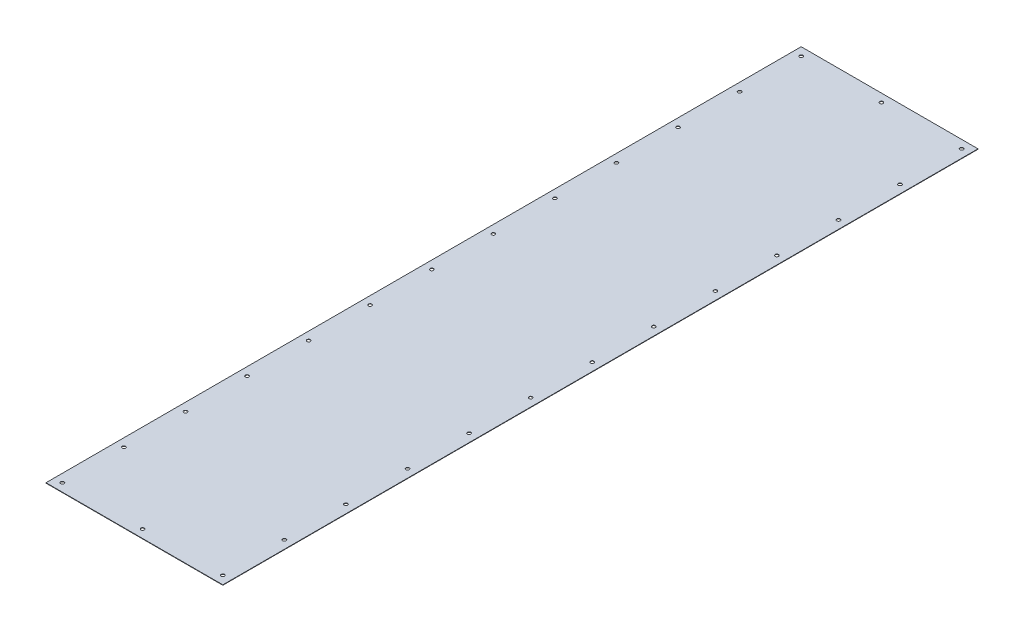
ISO-10303-21;
HEADER;
FILE_DESCRIPTION(('STEP AP214'),'2;1');
FILE_NAME('part.step','',(''),(''),'','','');
FILE_SCHEMA(('AUTOMOTIVE_DESIGN { 1 0 10303 214 1 1 1 1 }'));
ENDSEC;
DATA;
#1=APPLICATION_CONTEXT('core data for automotive mechanical design processes');
#2=APPLICATION_PROTOCOL_DEFINITION('international standard','automotive_design',2000,#1);
#3=PRODUCT_CONTEXT('',#1,'mechanical');
#4=PRODUCT('Part','Part','',(#3));
#5=PRODUCT_RELATED_PRODUCT_CATEGORY('part','',(#4));
#6=PRODUCT_DEFINITION_FORMATION('','',#4);
#7=PRODUCT_DEFINITION_CONTEXT('part definition',#1,'design');
#8=PRODUCT_DEFINITION('design','',#6,#7);
#9=PRODUCT_DEFINITION_SHAPE('','',#8);
#10=(LENGTH_UNIT() NAMED_UNIT(*) SI_UNIT(.MILLI.,.METRE.));
#11=(NAMED_UNIT(*) PLANE_ANGLE_UNIT() SI_UNIT($,.RADIAN.));
#12=(NAMED_UNIT(*) SI_UNIT($,.STERADIAN.) SOLID_ANGLE_UNIT());
#13=UNCERTAINTY_MEASURE_WITH_UNIT(LENGTH_MEASURE(1.E-05),#10,'distance_accuracy_value','');
#14=(GEOMETRIC_REPRESENTATION_CONTEXT(3) GLOBAL_UNCERTAINTY_ASSIGNED_CONTEXT((#13)) GLOBAL_UNIT_ASSIGNED_CONTEXT((#10,
#11,#12)) REPRESENTATION_CONTEXT('',''));
#15=CARTESIAN_POINT('',(0.,0.,0.));
#16=DIRECTION('',(0.,0.,1.));
#17=DIRECTION('',(1.,0.,0.));
#18=AXIS2_PLACEMENT_3D('',#15,#16,#17);
#19=CARTESIAN_POINT('',(0.,1.,0.));
#20=DIRECTION('',(0.,1.,0.));
#21=DIRECTION('',(0.,0.,1.));
#22=AXIS2_PLACEMENT_3D('',#19,#20,#21);
#23=PLANE('',#22);
#24=CARTESIAN_POINT('',(195.425000000019,1.,900.));
#25=DIRECTION('',(0.,1.,0.));
#26=DIRECTION('',(0.,0.,1.));
#27=AXIS2_PLACEMENT_3D('',#24,#25,#26);
#28=CIRCLE('',#27,4.1);
#29=CARTESIAN_POINT('',(195.425000000019,1.,904.1));
#30=VERTEX_POINT('',#29);
#31=EDGE_CURVE('E265',#30,#30,#28,.T.);
#32=ORIENTED_EDGE('',*,*,#31,.F.);
#33=EDGE_LOOP('',(#32));
#34=FACE_BOUND('',#33,.T.);
#35=CARTESIAN_POINT('',(195.425000000017,1.,750.));
#36=DIRECTION('',(0.,1.,0.));
#37=DIRECTION('',(0.,0.,1.));
#38=AXIS2_PLACEMENT_3D('',#35,#36,#37);
#39=CIRCLE('',#38,4.1);
#40=CARTESIAN_POINT('',(195.425000000017,1.,754.1));
#41=VERTEX_POINT('',#40);
#42=EDGE_CURVE('E253',#41,#41,#39,.T.);
#43=ORIENTED_EDGE('',*,*,#42,.F.);
#44=EDGE_LOOP('',(#43));
#45=FACE_BOUND('',#44,.T.);
#46=CARTESIAN_POINT('',(195.425000000016,1.,600.));
#47=DIRECTION('',(0.,1.,0.));
#48=DIRECTION('',(0.,0.,1.));
#49=AXIS2_PLACEMENT_3D('',#46,#47,#48);
#50=CIRCLE('',#49,4.1);
#51=CARTESIAN_POINT('',(195.425000000016,1.,604.1));
#52=VERTEX_POINT('',#51);
#53=EDGE_CURVE('E241',#52,#52,#50,.T.);
#54=ORIENTED_EDGE('',*,*,#53,.F.);
#55=EDGE_LOOP('',(#54));
#56=FACE_BOUND('',#55,.T.);
#57=CARTESIAN_POINT('',(195.425000000014,1.,450.));
#58=DIRECTION('',(0.,1.,0.));
#59=DIRECTION('',(0.,0.,1.));
#60=AXIS2_PLACEMENT_3D('',#57,#58,#59);
#61=CIRCLE('',#60,4.09999999999998);
#62=CARTESIAN_POINT('',(195.425000000014,1.,454.1));
#63=VERTEX_POINT('',#62);
#64=EDGE_CURVE('E229',#63,#63,#61,.T.);
#65=ORIENTED_EDGE('',*,*,#64,.F.);
#66=EDGE_LOOP('',(#65));
#67=FACE_BOUND('',#66,.T.);
#68=CARTESIAN_POINT('',(195.425000000013,1.,300.));
#69=DIRECTION('',(0.,1.,0.));
#70=DIRECTION('',(0.,0.,1.));
#71=AXIS2_PLACEMENT_3D('',#68,#69,#70);
#72=CIRCLE('',#71,4.09999999999998);
#73=CARTESIAN_POINT('',(195.425000000013,1.,304.1));
#74=VERTEX_POINT('',#73);
#75=EDGE_CURVE('E217',#74,#74,#72,.T.);
#76=ORIENTED_EDGE('',*,*,#75,.F.);
#77=EDGE_LOOP('',(#76));
#78=FACE_BOUND('',#77,.T.);
#79=CARTESIAN_POINT('',(195.425000000011,1.,150.));
#80=DIRECTION('',(0.,1.,0.));
#81=DIRECTION('',(0.,0.,1.));
#82=AXIS2_PLACEMENT_3D('',#79,#80,#81);
#83=CIRCLE('',#82,4.09999999999998);
#84=CARTESIAN_POINT('',(195.425000000011,1.,154.1));
#85=VERTEX_POINT('',#84);
#86=EDGE_CURVE('E205',#85,#85,#83,.T.);
#87=ORIENTED_EDGE('',*,*,#86,.F.);
#88=EDGE_LOOP('',(#87));
#89=FACE_BOUND('',#88,.T.);
#90=CARTESIAN_POINT('',(195.425000000009,1.,-3.33066907387547E-13));
#91=DIRECTION('',(0.,1.,0.));
#92=DIRECTION('',(0.,0.,1.));
#93=AXIS2_PLACEMENT_3D('',#90,#91,#92);
#94=CIRCLE('',#93,4.09999999999999);
#95=CARTESIAN_POINT('',(195.425000000009,1.,4.09999999999965));
#96=VERTEX_POINT('',#95);
#97=EDGE_CURVE('E193',#96,#96,#94,.T.);
#98=ORIENTED_EDGE('',*,*,#97,.F.);
#99=EDGE_LOOP('',(#98));
#100=FACE_BOUND('',#99,.T.);
#101=CARTESIAN_POINT('',(195.425000000008,1.,-150.));
#102=DIRECTION('',(0.,1.,0.));
#103=DIRECTION('',(0.,0.,1.));
#104=AXIS2_PLACEMENT_3D('',#101,#102,#103);
#105=CIRCLE('',#104,4.09999999999998);
#106=CARTESIAN_POINT('',(195.425000000008,1.,-145.9));
#107=VERTEX_POINT('',#106);
#108=EDGE_CURVE('E181',#107,#107,#105,.T.);
#109=ORIENTED_EDGE('',*,*,#108,.F.);
#110=EDGE_LOOP('',(#109));
#111=FACE_BOUND('',#110,.T.);
#112=CARTESIAN_POINT('',(195.425000000006,1.,-300.));
#113=DIRECTION('',(0.,1.,0.));
#114=DIRECTION('',(0.,0.,1.));
#115=AXIS2_PLACEMENT_3D('',#112,#113,#114);
#116=CIRCLE('',#115,4.09999999999998);
#117=CARTESIAN_POINT('',(195.425000000006,1.,-295.9));
#118=VERTEX_POINT('',#117);
#119=EDGE_CURVE('E169',#118,#118,#116,.T.);
#120=ORIENTED_EDGE('',*,*,#119,.F.);
#121=EDGE_LOOP('',(#120));
#122=FACE_BOUND('',#121,.T.);
#123=CARTESIAN_POINT('',(195.425000000005,1.,-450.));
#124=DIRECTION('',(0.,1.,0.));
#125=DIRECTION('',(0.,0.,1.));
#126=AXIS2_PLACEMENT_3D('',#123,#124,#125);
#127=CIRCLE('',#126,4.09999999999998);
#128=CARTESIAN_POINT('',(195.425000000005,1.,-445.9));
#129=VERTEX_POINT('',#128);
#130=EDGE_CURVE('E157',#129,#129,#127,.T.);
#131=ORIENTED_EDGE('',*,*,#130,.F.);
#132=EDGE_LOOP('',(#131));
#133=FACE_BOUND('',#132,.T.);
#134=CARTESIAN_POINT('',(195.425000000003,1.,-600.));
#135=DIRECTION('',(0.,1.,0.));
#136=DIRECTION('',(0.,0.,1.));
#137=AXIS2_PLACEMENT_3D('',#134,#135,#136);
#138=CIRCLE('',#137,4.10000000000003);
#139=CARTESIAN_POINT('',(195.425000000003,1.,-595.9));
#140=VERTEX_POINT('',#139);
#141=EDGE_CURVE('E145',#140,#140,#138,.T.);
#142=ORIENTED_EDGE('',*,*,#141,.F.);
#143=EDGE_LOOP('',(#142));
#144=FACE_BOUND('',#143,.T.);
#145=CARTESIAN_POINT('',(195.425000000002,1.,-750.));
#146=DIRECTION('',(0.,1.,0.));
#147=DIRECTION('',(0.,0.,1.));
#148=AXIS2_PLACEMENT_3D('',#145,#146,#147);
#149=CIRCLE('',#148,4.1);
#150=CARTESIAN_POINT('',(195.425000000002,1.,-745.9));
#151=VERTEX_POINT('',#150);
#152=EDGE_CURVE('E133',#151,#151,#149,.T.);
#153=ORIENTED_EDGE('',*,*,#152,.F.);
#154=EDGE_LOOP('',(#153));
#155=FACE_BOUND('',#154,.T.);
#156=CARTESIAN_POINT('',(0.,1.,900.));
#157=DIRECTION('',(0.,1.,0.));
#158=DIRECTION('',(0.,0.,1.));
#159=AXIS2_PLACEMENT_3D('',#156,#157,#158);
#160=CIRCLE('',#159,4.10000000000001);
#161=CARTESIAN_POINT('',(0.,1.,904.1));
#162=VERTEX_POINT('',#161);
#163=EDGE_CURVE('E121',#162,#162,#160,.T.);
#164=ORIENTED_EDGE('',*,*,#163,.F.);
#165=EDGE_LOOP('',(#164));
#166=FACE_BOUND('',#165,.T.);
#167=CARTESIAN_POINT('',(-195.425,1.,-900.));
#168=DIRECTION('',(0.,1.,0.));
#169=DIRECTION('',(0.,0.,1.));
#170=AXIS2_PLACEMENT_3D('',#167,#168,#169);
#171=CIRCLE('',#170,4.1);
#172=CARTESIAN_POINT('',(-195.425,1.,-895.9));
#173=VERTEX_POINT('',#172);
#174=EDGE_CURVE('E100',#173,#173,#171,.T.);
#175=ORIENTED_EDGE('',*,*,#174,.F.);
#176=EDGE_LOOP('',(#175));
#177=FACE_BOUND('',#176,.T.);
#178=DIRECTION('',(0.,0.,-1.));
#179=VECTOR('',#178,1.);
#180=CARTESIAN_POINT('',(215.425,1.,-920.));
#181=LINE('',#180,#179);
#182=CARTESIAN_POINT('',(215.425,1.,920.));
#183=VERTEX_POINT('',#182);
#184=CARTESIAN_POINT('',(215.425,1.,-920.));
#185=VERTEX_POINT('',#184);
#186=EDGE_CURVE('E85',#183,#185,#181,.T.);
#187=ORIENTED_EDGE('',*,*,#186,.T.);
#188=DIRECTION('',(-1.,0.,0.));
#189=VECTOR('',#188,1.);
#190=CARTESIAN_POINT('',(-215.425,1.,-920.));
#191=LINE('',#190,#189);
#192=CARTESIAN_POINT('',(-215.425,1.,-920.));
#193=VERTEX_POINT('',#192);
#194=EDGE_CURVE('E80',#185,#193,#191,.T.);
#195=ORIENTED_EDGE('',*,*,#194,.T.);
#196=DIRECTION('',(0.,0.,1.));
#197=VECTOR('',#196,1.);
#198=CARTESIAN_POINT('',(-215.425,1.,-920.));
#199=LINE('',#198,#197);
#200=CARTESIAN_POINT('',(-215.425,1.,920.));
#201=VERTEX_POINT('',#200);
#202=EDGE_CURVE('E83',#193,#201,#199,.T.);
#203=ORIENTED_EDGE('',*,*,#202,.T.);
#204=DIRECTION('',(1.,0.,0.));
#205=VECTOR('',#204,1.);
#206=CARTESIAN_POINT('',(-215.425,1.,920.));
#207=LINE('',#206,#205);
#208=EDGE_CURVE('E50',#201,#183,#207,.T.);
#209=ORIENTED_EDGE('',*,*,#208,.T.);
#210=EDGE_LOOP('',(#187,#195,#203,#209));
#211=FACE_BOUND('',#210,.T.);
#212=CARTESIAN_POINT('',(195.425,1.,-900.));
#213=DIRECTION('',(0.,1.,0.));
#214=DIRECTION('',(0.,0.,1.));
#215=AXIS2_PLACEMENT_3D('',#212,#213,#214);
#216=CIRCLE('',#215,4.1);
#217=CARTESIAN_POINT('',(195.425,1.,-895.9));
#218=VERTEX_POINT('',#217);
#219=EDGE_CURVE('E115',#218,#218,#216,.T.);
#220=ORIENTED_EDGE('',*,*,#219,.F.);
#221=EDGE_LOOP('',(#220));
#222=FACE_BOUND('',#221,.T.);
#223=CARTESIAN_POINT('',(-195.424999999998,1.,-750.));
#224=DIRECTION('',(0.,1.,0.));
#225=DIRECTION('',(0.,0.,1.));
#226=AXIS2_PLACEMENT_3D('',#223,#224,#225);
#227=CIRCLE('',#226,4.1);
#228=CARTESIAN_POINT('',(-195.424999999998,1.,-745.9));
#229=VERTEX_POINT('',#228);
#230=EDGE_CURVE('E127',#229,#229,#227,.T.);
#231=ORIENTED_EDGE('',*,*,#230,.F.);
#232=EDGE_LOOP('',(#231));
#233=FACE_BOUND('',#232,.T.);
#234=CARTESIAN_POINT('',(-195.424999999997,1.,-600.));
#235=DIRECTION('',(0.,1.,0.));
#236=DIRECTION('',(0.,0.,1.));
#237=AXIS2_PLACEMENT_3D('',#234,#235,#236);
#238=CIRCLE('',#237,4.10000000000003);
#239=CARTESIAN_POINT('',(-195.424999999997,1.,-595.9));
#240=VERTEX_POINT('',#239);
#241=EDGE_CURVE('E139',#240,#240,#238,.T.);
#242=ORIENTED_EDGE('',*,*,#241,.F.);
#243=EDGE_LOOP('',(#242));
#244=FACE_BOUND('',#243,.T.);
#245=CARTESIAN_POINT('',(-195.424999999995,1.,-450.));
#246=DIRECTION('',(0.,1.,0.));
#247=DIRECTION('',(0.,0.,1.));
#248=AXIS2_PLACEMENT_3D('',#245,#246,#247);
#249=CIRCLE('',#248,4.09999999999998);
#250=CARTESIAN_POINT('',(-195.424999999995,1.,-445.9));
#251=VERTEX_POINT('',#250);
#252=EDGE_CURVE('E151',#251,#251,#249,.T.);
#253=ORIENTED_EDGE('',*,*,#252,.F.);
#254=EDGE_LOOP('',(#253));
#255=FACE_BOUND('',#254,.T.);
#256=CARTESIAN_POINT('',(-195.424999999994,1.,-300.));
#257=DIRECTION('',(0.,1.,0.));
#258=DIRECTION('',(0.,0.,1.));
#259=AXIS2_PLACEMENT_3D('',#256,#257,#258);
#260=CIRCLE('',#259,4.09999999999998);
#261=CARTESIAN_POINT('',(-195.424999999994,1.,-295.9));
#262=VERTEX_POINT('',#261);
#263=EDGE_CURVE('E163',#262,#262,#260,.T.);
#264=ORIENTED_EDGE('',*,*,#263,.F.);
#265=EDGE_LOOP('',(#264));
#266=FACE_BOUND('',#265,.T.);
#267=CARTESIAN_POINT('',(-195.424999999992,1.,-150.));
#268=DIRECTION('',(0.,1.,0.));
#269=DIRECTION('',(0.,0.,1.));
#270=AXIS2_PLACEMENT_3D('',#267,#268,#269);
#271=CIRCLE('',#270,4.09999999999998);
#272=CARTESIAN_POINT('',(-195.424999999992,1.,-145.9));
#273=VERTEX_POINT('',#272);
#274=EDGE_CURVE('E175',#273,#273,#271,.T.);
#275=ORIENTED_EDGE('',*,*,#274,.F.);
#276=EDGE_LOOP('',(#275));
#277=FACE_BOUND('',#276,.T.);
#278=CARTESIAN_POINT('',(-195.424999999991,1.,-3.33066907387547E-13));
#279=DIRECTION('',(0.,1.,0.));
#280=DIRECTION('',(0.,0.,1.));
#281=AXIS2_PLACEMENT_3D('',#278,#279,#280);
#282=CIRCLE('',#281,4.09999999999999);
#283=CARTESIAN_POINT('',(-195.424999999991,1.,4.09999999999965));
#284=VERTEX_POINT('',#283);
#285=EDGE_CURVE('E187',#284,#284,#282,.T.);
#286=ORIENTED_EDGE('',*,*,#285,.F.);
#287=EDGE_LOOP('',(#286));
#288=FACE_BOUND('',#287,.T.);
#289=CARTESIAN_POINT('',(-195.424999999989,1.,150.));
#290=DIRECTION('',(0.,1.,0.));
#291=DIRECTION('',(0.,0.,1.));
#292=AXIS2_PLACEMENT_3D('',#289,#290,#291);
#293=CIRCLE('',#292,4.09999999999998);
#294=CARTESIAN_POINT('',(-195.424999999989,1.,154.1));
#295=VERTEX_POINT('',#294);
#296=EDGE_CURVE('E199',#295,#295,#293,.T.);
#297=ORIENTED_EDGE('',*,*,#296,.F.);
#298=EDGE_LOOP('',(#297));
#299=FACE_BOUND('',#298,.T.);
#300=CARTESIAN_POINT('',(-195.424999999987,1.,300.));
#301=DIRECTION('',(0.,1.,0.));
#302=DIRECTION('',(0.,0.,1.));
#303=AXIS2_PLACEMENT_3D('',#300,#301,#302);
#304=CIRCLE('',#303,4.09999999999998);
#305=CARTESIAN_POINT('',(-195.424999999987,1.,304.1));
#306=VERTEX_POINT('',#305);
#307=EDGE_CURVE('E211',#306,#306,#304,.T.);
#308=ORIENTED_EDGE('',*,*,#307,.F.);
#309=EDGE_LOOP('',(#308));
#310=FACE_BOUND('',#309,.T.);
#311=CARTESIAN_POINT('',(-195.424999999986,1.,450.));
#312=DIRECTION('',(0.,1.,0.));
#313=DIRECTION('',(0.,0.,1.));
#314=AXIS2_PLACEMENT_3D('',#311,#312,#313);
#315=CIRCLE('',#314,4.09999999999998);
#316=CARTESIAN_POINT('',(-195.424999999986,1.,454.1));
#317=VERTEX_POINT('',#316);
#318=EDGE_CURVE('E223',#317,#317,#315,.T.);
#319=ORIENTED_EDGE('',*,*,#318,.F.);
#320=EDGE_LOOP('',(#319));
#321=FACE_BOUND('',#320,.T.);
#322=CARTESIAN_POINT('',(-195.424999999984,1.,600.));
#323=DIRECTION('',(0.,1.,0.));
#324=DIRECTION('',(0.,0.,1.));
#325=AXIS2_PLACEMENT_3D('',#322,#323,#324);
#326=CIRCLE('',#325,4.1);
#327=CARTESIAN_POINT('',(-195.424999999984,1.,604.1));
#328=VERTEX_POINT('',#327);
#329=EDGE_CURVE('E235',#328,#328,#326,.T.);
#330=ORIENTED_EDGE('',*,*,#329,.F.);
#331=EDGE_LOOP('',(#330));
#332=FACE_BOUND('',#331,.T.);
#333=CARTESIAN_POINT('',(-195.424999999983,1.,750.));
#334=DIRECTION('',(0.,1.,0.));
#335=DIRECTION('',(0.,0.,1.));
#336=AXIS2_PLACEMENT_3D('',#333,#334,#335);
#337=CIRCLE('',#336,4.1);
#338=CARTESIAN_POINT('',(-195.424999999983,1.,754.1));
#339=VERTEX_POINT('',#338);
#340=EDGE_CURVE('E247',#339,#339,#337,.T.);
#341=ORIENTED_EDGE('',*,*,#340,.F.);
#342=EDGE_LOOP('',(#341));
#343=FACE_BOUND('',#342,.T.);
#344=CARTESIAN_POINT('',(-195.424999999981,1.,900.));
#345=DIRECTION('',(0.,1.,0.));
#346=DIRECTION('',(0.,0.,1.));
#347=AXIS2_PLACEMENT_3D('',#344,#345,#346);
#348=CIRCLE('',#347,4.1);
#349=CARTESIAN_POINT('',(-195.424999999981,1.,904.1));
#350=VERTEX_POINT('',#349);
#351=EDGE_CURVE('E259',#350,#350,#348,.T.);
#352=ORIENTED_EDGE('',*,*,#351,.F.);
#353=EDGE_LOOP('',(#352));
#354=FACE_BOUND('',#353,.T.);
#355=CARTESIAN_POINT('',(0.,1.,-900.));
#356=DIRECTION('',(0.,1.,0.));
#357=DIRECTION('',(0.,0.,1.));
#358=AXIS2_PLACEMENT_3D('',#355,#356,#357);
#359=CIRCLE('',#358,4.10000000000001);
#360=CARTESIAN_POINT('',(0.,1.,-895.9));
#361=VERTEX_POINT('',#360);
#362=EDGE_CURVE('E271',#361,#361,#359,.T.);
#363=ORIENTED_EDGE('',*,*,#362,.F.);
#364=EDGE_LOOP('',(#363));
#365=FACE_BOUND('',#364,.T.);
#366=ADVANCED_FACE('F33',(#34,#45,#56,#67,#78,#89,#100,#111,#122,#133,#144,#155,#166,#177,#211,
#222,#233,#244,#255,#266,#277,#288,#299,#310,#321,#332,#343,#354,#365),#23,.T.);
#367=CARTESIAN_POINT('',(0.,0.,0.));
#368=DIRECTION('',(0.,1.,0.));
#369=DIRECTION('',(0.,0.,1.));
#370=AXIS2_PLACEMENT_3D('',#367,#368,#369);
#371=PLANE('',#370);
#372=DIRECTION('',(0.,0.,-1.));
#373=VECTOR('',#372,1.);
#374=CARTESIAN_POINT('',(215.425,0.,-920.));
#375=LINE('',#374,#373);
#376=CARTESIAN_POINT('',(215.425,0.,920.));
#377=VERTEX_POINT('',#376);
#378=CARTESIAN_POINT('',(215.425,0.,-920.));
#379=VERTEX_POINT('',#378);
#380=EDGE_CURVE('E97',#377,#379,#375,.T.);
#381=ORIENTED_EDGE('',*,*,#380,.F.);
#382=DIRECTION('',(1.,0.,0.));
#383=VECTOR('',#382,1.);
#384=CARTESIAN_POINT('',(-215.425,0.,920.));
#385=LINE('',#384,#383);
#386=CARTESIAN_POINT('',(-215.425,0.,920.));
#387=VERTEX_POINT('',#386);
#388=EDGE_CURVE('E73',#387,#377,#385,.T.);
#389=ORIENTED_EDGE('',*,*,#388,.F.);
#390=DIRECTION('',(0.,0.,1.));
#391=VECTOR('',#390,1.);
#392=CARTESIAN_POINT('',(-215.425,0.,-920.));
#393=LINE('',#392,#391);
#394=CARTESIAN_POINT('',(-215.425,0.,-920.));
#395=VERTEX_POINT('',#394);
#396=EDGE_CURVE('E67',#395,#387,#393,.T.);
#397=ORIENTED_EDGE('',*,*,#396,.F.);
#398=DIRECTION('',(-1.,0.,0.));
#399=VECTOR('',#398,1.);
#400=CARTESIAN_POINT('',(-215.425,0.,-920.));
#401=LINE('',#400,#399);
#402=EDGE_CURVE('E89',#379,#395,#401,.T.);
#403=ORIENTED_EDGE('',*,*,#402,.F.);
#404=EDGE_LOOP('',(#381,#389,#397,#403));
#405=FACE_BOUND('',#404,.T.);
#406=CARTESIAN_POINT('',(-195.425,0.,-900.));
#407=DIRECTION('',(0.,1.,0.));
#408=DIRECTION('',(0.,0.,1.));
#409=AXIS2_PLACEMENT_3D('',#406,#407,#408);
#410=CIRCLE('',#409,4.1);
#411=CARTESIAN_POINT('',(-195.425,0.,-895.9));
#412=VERTEX_POINT('',#411);
#413=EDGE_CURVE('E112',#412,#412,#410,.T.);
#414=ORIENTED_EDGE('',*,*,#413,.T.);
#415=EDGE_LOOP('',(#414));
#416=FACE_BOUND('',#415,.T.);
#417=CARTESIAN_POINT('',(195.425,0.,-900.));
#418=DIRECTION('',(0.,1.,0.));
#419=DIRECTION('',(0.,0.,1.));
#420=AXIS2_PLACEMENT_3D('',#417,#418,#419);
#421=CIRCLE('',#420,4.1);
#422=CARTESIAN_POINT('',(195.425,0.,-895.9));
#423=VERTEX_POINT('',#422);
#424=EDGE_CURVE('E118',#423,#423,#421,.T.);
#425=ORIENTED_EDGE('',*,*,#424,.T.);
#426=EDGE_LOOP('',(#425));
#427=FACE_BOUND('',#426,.T.);
#428=CARTESIAN_POINT('',(0.,0.,900.));
#429=DIRECTION('',(0.,1.,0.));
#430=DIRECTION('',(0.,0.,1.));
#431=AXIS2_PLACEMENT_3D('',#428,#429,#430);
#432=CIRCLE('',#431,4.10000000000001);
#433=CARTESIAN_POINT('',(0.,0.,904.1));
#434=VERTEX_POINT('',#433);
#435=EDGE_CURVE('E124',#434,#434,#432,.T.);
#436=ORIENTED_EDGE('',*,*,#435,.T.);
#437=EDGE_LOOP('',(#436));
#438=FACE_BOUND('',#437,.T.);
#439=CARTESIAN_POINT('',(-195.424999999998,0.,-750.));
#440=DIRECTION('',(0.,1.,0.));
#441=DIRECTION('',(0.,0.,1.));
#442=AXIS2_PLACEMENT_3D('',#439,#440,#441);
#443=CIRCLE('',#442,4.1);
#444=CARTESIAN_POINT('',(-195.424999999998,0.,-745.9));
#445=VERTEX_POINT('',#444);
#446=EDGE_CURVE('E130',#445,#445,#443,.T.);
#447=ORIENTED_EDGE('',*,*,#446,.T.);
#448=EDGE_LOOP('',(#447));
#449=FACE_BOUND('',#448,.T.);
#450=CARTESIAN_POINT('',(195.425000000002,0.,-750.));
#451=DIRECTION('',(0.,1.,0.));
#452=DIRECTION('',(0.,0.,1.));
#453=AXIS2_PLACEMENT_3D('',#450,#451,#452);
#454=CIRCLE('',#453,4.1);
#455=CARTESIAN_POINT('',(195.425000000002,0.,-745.9));
#456=VERTEX_POINT('',#455);
#457=EDGE_CURVE('E136',#456,#456,#454,.T.);
#458=ORIENTED_EDGE('',*,*,#457,.T.);
#459=EDGE_LOOP('',(#458));
#460=FACE_BOUND('',#459,.T.);
#461=CARTESIAN_POINT('',(-195.424999999997,0.,-600.));
#462=DIRECTION('',(0.,1.,0.));
#463=DIRECTION('',(0.,0.,1.));
#464=AXIS2_PLACEMENT_3D('',#461,#462,#463);
#465=CIRCLE('',#464,4.10000000000003);
#466=CARTESIAN_POINT('',(-195.424999999997,0.,-595.9));
#467=VERTEX_POINT('',#466);
#468=EDGE_CURVE('E142',#467,#467,#465,.T.);
#469=ORIENTED_EDGE('',*,*,#468,.T.);
#470=EDGE_LOOP('',(#469));
#471=FACE_BOUND('',#470,.T.);
#472=CARTESIAN_POINT('',(195.425000000003,0.,-600.));
#473=DIRECTION('',(0.,1.,0.));
#474=DIRECTION('',(0.,0.,1.));
#475=AXIS2_PLACEMENT_3D('',#472,#473,#474);
#476=CIRCLE('',#475,4.10000000000003);
#477=CARTESIAN_POINT('',(195.425000000003,0.,-595.9));
#478=VERTEX_POINT('',#477);
#479=EDGE_CURVE('E148',#478,#478,#476,.T.);
#480=ORIENTED_EDGE('',*,*,#479,.T.);
#481=EDGE_LOOP('',(#480));
#482=FACE_BOUND('',#481,.T.);
#483=CARTESIAN_POINT('',(-195.424999999995,0.,-450.));
#484=DIRECTION('',(0.,1.,0.));
#485=DIRECTION('',(0.,0.,1.));
#486=AXIS2_PLACEMENT_3D('',#483,#484,#485);
#487=CIRCLE('',#486,4.09999999999998);
#488=CARTESIAN_POINT('',(-195.424999999995,0.,-445.9));
#489=VERTEX_POINT('',#488);
#490=EDGE_CURVE('E154',#489,#489,#487,.T.);
#491=ORIENTED_EDGE('',*,*,#490,.T.);
#492=EDGE_LOOP('',(#491));
#493=FACE_BOUND('',#492,.T.);
#494=CARTESIAN_POINT('',(195.425000000005,0.,-450.));
#495=DIRECTION('',(0.,1.,0.));
#496=DIRECTION('',(0.,0.,1.));
#497=AXIS2_PLACEMENT_3D('',#494,#495,#496);
#498=CIRCLE('',#497,4.09999999999998);
#499=CARTESIAN_POINT('',(195.425000000005,0.,-445.9));
#500=VERTEX_POINT('',#499);
#501=EDGE_CURVE('E160',#500,#500,#498,.T.);
#502=ORIENTED_EDGE('',*,*,#501,.T.);
#503=EDGE_LOOP('',(#502));
#504=FACE_BOUND('',#503,.T.);
#505=CARTESIAN_POINT('',(-195.424999999994,0.,-300.));
#506=DIRECTION('',(0.,1.,0.));
#507=DIRECTION('',(0.,0.,1.));
#508=AXIS2_PLACEMENT_3D('',#505,#506,#507);
#509=CIRCLE('',#508,4.09999999999998);
#510=CARTESIAN_POINT('',(-195.424999999994,0.,-295.9));
#511=VERTEX_POINT('',#510);
#512=EDGE_CURVE('E166',#511,#511,#509,.T.);
#513=ORIENTED_EDGE('',*,*,#512,.T.);
#514=EDGE_LOOP('',(#513));
#515=FACE_BOUND('',#514,.T.);
#516=CARTESIAN_POINT('',(195.425000000006,0.,-300.));
#517=DIRECTION('',(0.,1.,0.));
#518=DIRECTION('',(0.,0.,1.));
#519=AXIS2_PLACEMENT_3D('',#516,#517,#518);
#520=CIRCLE('',#519,4.09999999999998);
#521=CARTESIAN_POINT('',(195.425000000006,0.,-295.9));
#522=VERTEX_POINT('',#521);
#523=EDGE_CURVE('E172',#522,#522,#520,.T.);
#524=ORIENTED_EDGE('',*,*,#523,.T.);
#525=EDGE_LOOP('',(#524));
#526=FACE_BOUND('',#525,.T.);
#527=CARTESIAN_POINT('',(-195.424999999992,0.,-150.));
#528=DIRECTION('',(0.,1.,0.));
#529=DIRECTION('',(0.,0.,1.));
#530=AXIS2_PLACEMENT_3D('',#527,#528,#529);
#531=CIRCLE('',#530,4.09999999999998);
#532=CARTESIAN_POINT('',(-195.424999999992,0.,-145.9));
#533=VERTEX_POINT('',#532);
#534=EDGE_CURVE('E178',#533,#533,#531,.T.);
#535=ORIENTED_EDGE('',*,*,#534,.T.);
#536=EDGE_LOOP('',(#535));
#537=FACE_BOUND('',#536,.T.);
#538=CARTESIAN_POINT('',(195.425000000008,0.,-150.));
#539=DIRECTION('',(0.,1.,0.));
#540=DIRECTION('',(0.,0.,1.));
#541=AXIS2_PLACEMENT_3D('',#538,#539,#540);
#542=CIRCLE('',#541,4.09999999999998);
#543=CARTESIAN_POINT('',(195.425000000008,0.,-145.9));
#544=VERTEX_POINT('',#543);
#545=EDGE_CURVE('E184',#544,#544,#542,.T.);
#546=ORIENTED_EDGE('',*,*,#545,.T.);
#547=EDGE_LOOP('',(#546));
#548=FACE_BOUND('',#547,.T.);
#549=CARTESIAN_POINT('',(-195.424999999991,0.,-3.33066907387547E-13));
#550=DIRECTION('',(0.,1.,0.));
#551=DIRECTION('',(0.,0.,1.));
#552=AXIS2_PLACEMENT_3D('',#549,#550,#551);
#553=CIRCLE('',#552,4.09999999999999);
#554=CARTESIAN_POINT('',(-195.424999999991,0.,4.09999999999965));
#555=VERTEX_POINT('',#554);
#556=EDGE_CURVE('E190',#555,#555,#553,.T.);
#557=ORIENTED_EDGE('',*,*,#556,.T.);
#558=EDGE_LOOP('',(#557));
#559=FACE_BOUND('',#558,.T.);
#560=CARTESIAN_POINT('',(195.425000000009,0.,-3.33066907387547E-13));
#561=DIRECTION('',(0.,1.,0.));
#562=DIRECTION('',(0.,0.,1.));
#563=AXIS2_PLACEMENT_3D('',#560,#561,#562);
#564=CIRCLE('',#563,4.09999999999999);
#565=CARTESIAN_POINT('',(195.425000000009,0.,4.09999999999965));
#566=VERTEX_POINT('',#565);
#567=EDGE_CURVE('E196',#566,#566,#564,.T.);
#568=ORIENTED_EDGE('',*,*,#567,.T.);
#569=EDGE_LOOP('',(#568));
#570=FACE_BOUND('',#569,.T.);
#571=CARTESIAN_POINT('',(-195.424999999989,0.,150.));
#572=DIRECTION('',(0.,1.,0.));
#573=DIRECTION('',(0.,0.,1.));
#574=AXIS2_PLACEMENT_3D('',#571,#572,#573);
#575=CIRCLE('',#574,4.09999999999998);
#576=CARTESIAN_POINT('',(-195.424999999989,0.,154.1));
#577=VERTEX_POINT('',#576);
#578=EDGE_CURVE('E202',#577,#577,#575,.T.);
#579=ORIENTED_EDGE('',*,*,#578,.T.);
#580=EDGE_LOOP('',(#579));
#581=FACE_BOUND('',#580,.T.);
#582=CARTESIAN_POINT('',(195.425000000011,0.,150.));
#583=DIRECTION('',(0.,1.,0.));
#584=DIRECTION('',(0.,0.,1.));
#585=AXIS2_PLACEMENT_3D('',#582,#583,#584);
#586=CIRCLE('',#585,4.09999999999998);
#587=CARTESIAN_POINT('',(195.425000000011,0.,154.1));
#588=VERTEX_POINT('',#587);
#589=EDGE_CURVE('E208',#588,#588,#586,.T.);
#590=ORIENTED_EDGE('',*,*,#589,.T.);
#591=EDGE_LOOP('',(#590));
#592=FACE_BOUND('',#591,.T.);
#593=CARTESIAN_POINT('',(-195.424999999987,0.,300.));
#594=DIRECTION('',(0.,1.,0.));
#595=DIRECTION('',(0.,0.,1.));
#596=AXIS2_PLACEMENT_3D('',#593,#594,#595);
#597=CIRCLE('',#596,4.09999999999998);
#598=CARTESIAN_POINT('',(-195.424999999987,0.,304.1));
#599=VERTEX_POINT('',#598);
#600=EDGE_CURVE('E214',#599,#599,#597,.T.);
#601=ORIENTED_EDGE('',*,*,#600,.T.);
#602=EDGE_LOOP('',(#601));
#603=FACE_BOUND('',#602,.T.);
#604=CARTESIAN_POINT('',(195.425000000013,0.,300.));
#605=DIRECTION('',(0.,1.,0.));
#606=DIRECTION('',(0.,0.,1.));
#607=AXIS2_PLACEMENT_3D('',#604,#605,#606);
#608=CIRCLE('',#607,4.09999999999998);
#609=CARTESIAN_POINT('',(195.425000000013,0.,304.1));
#610=VERTEX_POINT('',#609);
#611=EDGE_CURVE('E220',#610,#610,#608,.T.);
#612=ORIENTED_EDGE('',*,*,#611,.T.);
#613=EDGE_LOOP('',(#612));
#614=FACE_BOUND('',#613,.T.);
#615=CARTESIAN_POINT('',(-195.424999999986,0.,450.));
#616=DIRECTION('',(0.,1.,0.));
#617=DIRECTION('',(0.,0.,1.));
#618=AXIS2_PLACEMENT_3D('',#615,#616,#617);
#619=CIRCLE('',#618,4.09999999999998);
#620=CARTESIAN_POINT('',(-195.424999999986,0.,454.1));
#621=VERTEX_POINT('',#620);
#622=EDGE_CURVE('E226',#621,#621,#619,.T.);
#623=ORIENTED_EDGE('',*,*,#622,.T.);
#624=EDGE_LOOP('',(#623));
#625=FACE_BOUND('',#624,.T.);
#626=CARTESIAN_POINT('',(195.425000000014,0.,450.));
#627=DIRECTION('',(0.,1.,0.));
#628=DIRECTION('',(0.,0.,1.));
#629=AXIS2_PLACEMENT_3D('',#626,#627,#628);
#630=CIRCLE('',#629,4.09999999999998);
#631=CARTESIAN_POINT('',(195.425000000014,0.,454.1));
#632=VERTEX_POINT('',#631);
#633=EDGE_CURVE('E232',#632,#632,#630,.T.);
#634=ORIENTED_EDGE('',*,*,#633,.T.);
#635=EDGE_LOOP('',(#634));
#636=FACE_BOUND('',#635,.T.);
#637=CARTESIAN_POINT('',(-195.424999999984,0.,600.));
#638=DIRECTION('',(0.,1.,0.));
#639=DIRECTION('',(0.,0.,1.));
#640=AXIS2_PLACEMENT_3D('',#637,#638,#639);
#641=CIRCLE('',#640,4.1);
#642=CARTESIAN_POINT('',(-195.424999999984,0.,604.1));
#643=VERTEX_POINT('',#642);
#644=EDGE_CURVE('E238',#643,#643,#641,.T.);
#645=ORIENTED_EDGE('',*,*,#644,.T.);
#646=EDGE_LOOP('',(#645));
#647=FACE_BOUND('',#646,.T.);
#648=CARTESIAN_POINT('',(195.425000000016,0.,600.));
#649=DIRECTION('',(0.,1.,0.));
#650=DIRECTION('',(0.,0.,1.));
#651=AXIS2_PLACEMENT_3D('',#648,#649,#650);
#652=CIRCLE('',#651,4.1);
#653=CARTESIAN_POINT('',(195.425000000016,0.,604.1));
#654=VERTEX_POINT('',#653);
#655=EDGE_CURVE('E244',#654,#654,#652,.T.);
#656=ORIENTED_EDGE('',*,*,#655,.T.);
#657=EDGE_LOOP('',(#656));
#658=FACE_BOUND('',#657,.T.);
#659=CARTESIAN_POINT('',(-195.424999999983,0.,750.));
#660=DIRECTION('',(0.,1.,0.));
#661=DIRECTION('',(0.,0.,1.));
#662=AXIS2_PLACEMENT_3D('',#659,#660,#661);
#663=CIRCLE('',#662,4.1);
#664=CARTESIAN_POINT('',(-195.424999999983,0.,754.1));
#665=VERTEX_POINT('',#664);
#666=EDGE_CURVE('E250',#665,#665,#663,.T.);
#667=ORIENTED_EDGE('',*,*,#666,.T.);
#668=EDGE_LOOP('',(#667));
#669=FACE_BOUND('',#668,.T.);
#670=CARTESIAN_POINT('',(195.425000000017,0.,750.));
#671=DIRECTION('',(0.,1.,0.));
#672=DIRECTION('',(0.,0.,1.));
#673=AXIS2_PLACEMENT_3D('',#670,#671,#672);
#674=CIRCLE('',#673,4.1);
#675=CARTESIAN_POINT('',(195.425000000017,0.,754.1));
#676=VERTEX_POINT('',#675);
#677=EDGE_CURVE('E256',#676,#676,#674,.T.);
#678=ORIENTED_EDGE('',*,*,#677,.T.);
#679=EDGE_LOOP('',(#678));
#680=FACE_BOUND('',#679,.T.);
#681=CARTESIAN_POINT('',(-195.424999999981,0.,900.));
#682=DIRECTION('',(0.,1.,0.));
#683=DIRECTION('',(0.,0.,1.));
#684=AXIS2_PLACEMENT_3D('',#681,#682,#683);
#685=CIRCLE('',#684,4.1);
#686=CARTESIAN_POINT('',(-195.424999999981,0.,904.1));
#687=VERTEX_POINT('',#686);
#688=EDGE_CURVE('E262',#687,#687,#685,.T.);
#689=ORIENTED_EDGE('',*,*,#688,.T.);
#690=EDGE_LOOP('',(#689));
#691=FACE_BOUND('',#690,.T.);
#692=CARTESIAN_POINT('',(195.425000000019,0.,900.));
#693=DIRECTION('',(0.,1.,0.));
#694=DIRECTION('',(0.,0.,1.));
#695=AXIS2_PLACEMENT_3D('',#692,#693,#694);
#696=CIRCLE('',#695,4.1);
#697=CARTESIAN_POINT('',(195.425000000019,0.,904.1));
#698=VERTEX_POINT('',#697);
#699=EDGE_CURVE('E268',#698,#698,#696,.T.);
#700=ORIENTED_EDGE('',*,*,#699,.T.);
#701=EDGE_LOOP('',(#700));
#702=FACE_BOUND('',#701,.T.);
#703=CARTESIAN_POINT('',(0.,0.,-900.));
#704=DIRECTION('',(0.,1.,0.));
#705=DIRECTION('',(0.,0.,1.));
#706=AXIS2_PLACEMENT_3D('',#703,#704,#705);
#707=CIRCLE('',#706,4.10000000000001);
#708=CARTESIAN_POINT('',(0.,0.,-895.9));
#709=VERTEX_POINT('',#708);
#710=EDGE_CURVE('E274',#709,#709,#707,.T.);
#711=ORIENTED_EDGE('',*,*,#710,.T.);
#712=EDGE_LOOP('',(#711));
#713=FACE_BOUND('',#712,.T.);
#714=ADVANCED_FACE('F108',(#405,#416,#427,#438,#449,#460,#471,#482,#493,#504,#515,#526,#537,
#548,#559,#570,#581,#592,#603,#614,#625,#636,#647,#658,#669,#680,#691,#702,#713),#371,.F.);
#715=CARTESIAN_POINT('',(215.425,1.,-920.));
#716=DIRECTION('',(-1.,0.,0.));
#717=DIRECTION('',(0.,0.,1.));
#718=AXIS2_PLACEMENT_3D('',#715,#716,#717);
#719=PLANE('',#718);
#720=ORIENTED_EDGE('',*,*,#380,.T.);
#721=DIRECTION('',(0.,-1.,0.));
#722=VECTOR('',#721,1.);
#723=CARTESIAN_POINT('',(215.425,1.,-920.));
#724=LINE('',#723,#722);
#725=EDGE_CURVE('E11',#185,#379,#724,.T.);
#726=ORIENTED_EDGE('',*,*,#725,.F.);
#727=ORIENTED_EDGE('',*,*,#186,.F.);
#728=DIRECTION('',(0.,-1.,0.));
#729=VECTOR('',#728,1.);
#730=CARTESIAN_POINT('',(215.425,1.,920.));
#731=LINE('',#730,#729);
#732=EDGE_CURVE('E93',#183,#377,#731,.T.);
#733=ORIENTED_EDGE('',*,*,#732,.T.);
#734=EDGE_LOOP('',(#720,#726,#727,#733));
#735=FACE_BOUND('',#734,.T.);
#736=ADVANCED_FACE('F35',(#735),#719,.F.);
#737=CARTESIAN_POINT('',(-215.425,1.,-920.));
#738=DIRECTION('',(0.,0.,1.));
#739=DIRECTION('',(1.,0.,0.));
#740=AXIS2_PLACEMENT_3D('',#737,#738,#739);
#741=PLANE('',#740);
#742=ORIENTED_EDGE('',*,*,#402,.T.);
#743=DIRECTION('',(0.,-1.,0.));
#744=VECTOR('',#743,1.);
#745=CARTESIAN_POINT('',(-215.425,1.,-920.));
#746=LINE('',#745,#744);
#747=EDGE_CURVE('E42',#193,#395,#746,.T.);
#748=ORIENTED_EDGE('',*,*,#747,.F.);
#749=ORIENTED_EDGE('',*,*,#194,.F.);
#750=ORIENTED_EDGE('',*,*,#725,.T.);
#751=EDGE_LOOP('',(#742,#748,#749,#750));
#752=FACE_BOUND('',#751,.T.);
#753=ADVANCED_FACE('F88',(#752),#741,.F.);
#754=CARTESIAN_POINT('',(-215.425,1.,-920.));
#755=DIRECTION('',(1.,0.,0.));
#756=DIRECTION('',(0.,0.,-1.));
#757=AXIS2_PLACEMENT_3D('',#754,#755,#756);
#758=PLANE('',#757);
#759=ORIENTED_EDGE('',*,*,#396,.T.);
#760=DIRECTION('',(0.,-1.,0.));
#761=VECTOR('',#760,1.);
#762=CARTESIAN_POINT('',(-215.425,1.,920.));
#763=LINE('',#762,#761);
#764=EDGE_CURVE('E90',#201,#387,#763,.T.);
#765=ORIENTED_EDGE('',*,*,#764,.F.);
#766=ORIENTED_EDGE('',*,*,#202,.F.);
#767=ORIENTED_EDGE('',*,*,#747,.T.);
#768=EDGE_LOOP('',(#759,#765,#766,#767));
#769=FACE_BOUND('',#768,.T.);
#770=ADVANCED_FACE('F91',(#769),#758,.F.);
#771=CARTESIAN_POINT('',(-215.425,1.,920.));
#772=DIRECTION('',(0.,0.,-1.));
#773=DIRECTION('',(-1.,0.,0.));
#774=AXIS2_PLACEMENT_3D('',#771,#772,#773);
#775=PLANE('',#774);
#776=ORIENTED_EDGE('',*,*,#388,.T.);
#777=ORIENTED_EDGE('',*,*,#732,.F.);
#778=ORIENTED_EDGE('',*,*,#208,.F.);
#779=ORIENTED_EDGE('',*,*,#764,.T.);
#780=EDGE_LOOP('',(#776,#777,#778,#779));
#781=FACE_BOUND('',#780,.T.);
#782=ADVANCED_FACE('F105',(#781),#775,.F.);
#783=CARTESIAN_POINT('',(-195.425,1.,-900.));
#784=DIRECTION('',(0.,-1.,0.));
#785=DIRECTION('',(0.,0.,-1.));
#786=AXIS2_PLACEMENT_3D('',#783,#784,#785);
#787=CYLINDRICAL_SURFACE('',#786,4.1);
#788=ORIENTED_EDGE('',*,*,#174,.T.);
#789=EDGE_LOOP('',(#788));
#790=FACE_BOUND('',#789,.T.);
#791=ORIENTED_EDGE('',*,*,#413,.F.);
#792=EDGE_LOOP('',(#791));
#793=FACE_BOUND('',#792,.T.);
#794=ADVANCED_FACE('F293',(#790,#793),#787,.F.);
#795=CARTESIAN_POINT('',(195.425,1.,-900.));
#796=DIRECTION('',(0.,-1.,0.));
#797=DIRECTION('',(0.,0.,-1.));
#798=AXIS2_PLACEMENT_3D('',#795,#796,#797);
#799=CYLINDRICAL_SURFACE('',#798,4.1);
#800=ORIENTED_EDGE('',*,*,#219,.T.);
#801=EDGE_LOOP('',(#800));
#802=FACE_BOUND('',#801,.T.);
#803=ORIENTED_EDGE('',*,*,#424,.F.);
#804=EDGE_LOOP('',(#803));
#805=FACE_BOUND('',#804,.T.);
#806=ADVANCED_FACE('F339',(#802,#805),#799,.F.);
#807=CARTESIAN_POINT('',(0.,1.,900.));
#808=DIRECTION('',(0.,-1.,0.));
#809=DIRECTION('',(0.,0.,-1.));
#810=AXIS2_PLACEMENT_3D('',#807,#808,#809);
#811=CYLINDRICAL_SURFACE('',#810,4.10000000000001);
#812=ORIENTED_EDGE('',*,*,#163,.T.);
#813=EDGE_LOOP('',(#812));
#814=FACE_BOUND('',#813,.T.);
#815=ORIENTED_EDGE('',*,*,#435,.F.);
#816=EDGE_LOOP('',(#815));
#817=FACE_BOUND('',#816,.T.);
#818=ADVANCED_FACE('F347',(#814,#817),#811,.F.);
#819=CARTESIAN_POINT('',(-195.424999999998,1.,-750.));
#820=DIRECTION('',(0.,-1.,0.));
#821=DIRECTION('',(0.,0.,-1.));
#822=AXIS2_PLACEMENT_3D('',#819,#820,#821);
#823=CYLINDRICAL_SURFACE('',#822,4.1);
#824=ORIENTED_EDGE('',*,*,#230,.T.);
#825=EDGE_LOOP('',(#824));
#826=FACE_BOUND('',#825,.T.);
#827=ORIENTED_EDGE('',*,*,#446,.F.);
#828=EDGE_LOOP('',(#827));
#829=FACE_BOUND('',#828,.T.);
#830=ADVANCED_FACE('F355',(#826,#829),#823,.F.);
#831=CARTESIAN_POINT('',(195.425000000002,1.,-750.));
#832=DIRECTION('',(0.,-1.,0.));
#833=DIRECTION('',(0.,0.,-1.));
#834=AXIS2_PLACEMENT_3D('',#831,#832,#833);
#835=CYLINDRICAL_SURFACE('',#834,4.1);
#836=ORIENTED_EDGE('',*,*,#152,.T.);
#837=EDGE_LOOP('',(#836));
#838=FACE_BOUND('',#837,.T.);
#839=ORIENTED_EDGE('',*,*,#457,.F.);
#840=EDGE_LOOP('',(#839));
#841=FACE_BOUND('',#840,.T.);
#842=ADVANCED_FACE('F364',(#838,#841),#835,.F.);
#843=CARTESIAN_POINT('',(-195.424999999997,1.,-600.));
#844=DIRECTION('',(0.,-1.,0.));
#845=DIRECTION('',(0.,0.,-1.));
#846=AXIS2_PLACEMENT_3D('',#843,#844,#845);
#847=CYLINDRICAL_SURFACE('',#846,4.10000000000003);
#848=ORIENTED_EDGE('',*,*,#241,.T.);
#849=EDGE_LOOP('',(#848));
#850=FACE_BOUND('',#849,.T.);
#851=ORIENTED_EDGE('',*,*,#468,.F.);
#852=EDGE_LOOP('',(#851));
#853=FACE_BOUND('',#852,.T.);
#854=ADVANCED_FACE('F373',(#850,#853),#847,.F.);
#855=CARTESIAN_POINT('',(195.425000000003,1.,-600.));
#856=DIRECTION('',(0.,-1.,0.));
#857=DIRECTION('',(0.,0.,-1.));
#858=AXIS2_PLACEMENT_3D('',#855,#856,#857);
#859=CYLINDRICAL_SURFACE('',#858,4.10000000000003);
#860=ORIENTED_EDGE('',*,*,#141,.T.);
#861=EDGE_LOOP('',(#860));
#862=FACE_BOUND('',#861,.T.);
#863=ORIENTED_EDGE('',*,*,#479,.F.);
#864=EDGE_LOOP('',(#863));
#865=FACE_BOUND('',#864,.T.);
#866=ADVANCED_FACE('F382',(#862,#865),#859,.F.);
#867=CARTESIAN_POINT('',(-195.424999999995,1.,-450.));
#868=DIRECTION('',(0.,-1.,0.));
#869=DIRECTION('',(0.,0.,-1.));
#870=AXIS2_PLACEMENT_3D('',#867,#868,#869);
#871=CYLINDRICAL_SURFACE('',#870,4.09999999999998);
#872=ORIENTED_EDGE('',*,*,#252,.T.);
#873=EDGE_LOOP('',(#872));
#874=FACE_BOUND('',#873,.T.);
#875=ORIENTED_EDGE('',*,*,#490,.F.);
#876=EDGE_LOOP('',(#875));
#877=FACE_BOUND('',#876,.T.);
#878=ADVANCED_FACE('F391',(#874,#877),#871,.F.);
#879=CARTESIAN_POINT('',(195.425000000005,1.,-450.));
#880=DIRECTION('',(0.,-1.,0.));
#881=DIRECTION('',(0.,0.,-1.));
#882=AXIS2_PLACEMENT_3D('',#879,#880,#881);
#883=CYLINDRICAL_SURFACE('',#882,4.09999999999998);
#884=ORIENTED_EDGE('',*,*,#130,.T.);
#885=EDGE_LOOP('',(#884));
#886=FACE_BOUND('',#885,.T.);
#887=ORIENTED_EDGE('',*,*,#501,.F.);
#888=EDGE_LOOP('',(#887));
#889=FACE_BOUND('',#888,.T.);
#890=ADVANCED_FACE('F400',(#886,#889),#883,.F.);
#891=CARTESIAN_POINT('',(-195.424999999994,1.,-300.));
#892=DIRECTION('',(0.,-1.,0.));
#893=DIRECTION('',(0.,0.,-1.));
#894=AXIS2_PLACEMENT_3D('',#891,#892,#893);
#895=CYLINDRICAL_SURFACE('',#894,4.09999999999998);
#896=ORIENTED_EDGE('',*,*,#263,.T.);
#897=EDGE_LOOP('',(#896));
#898=FACE_BOUND('',#897,.T.);
#899=ORIENTED_EDGE('',*,*,#512,.F.);
#900=EDGE_LOOP('',(#899));
#901=FACE_BOUND('',#900,.T.);
#902=ADVANCED_FACE('F409',(#898,#901),#895,.F.);
#903=CARTESIAN_POINT('',(195.425000000006,1.,-300.));
#904=DIRECTION('',(0.,-1.,0.));
#905=DIRECTION('',(0.,0.,-1.));
#906=AXIS2_PLACEMENT_3D('',#903,#904,#905);
#907=CYLINDRICAL_SURFACE('',#906,4.09999999999998);
#908=ORIENTED_EDGE('',*,*,#119,.T.);
#909=EDGE_LOOP('',(#908));
#910=FACE_BOUND('',#909,.T.);
#911=ORIENTED_EDGE('',*,*,#523,.F.);
#912=EDGE_LOOP('',(#911));
#913=FACE_BOUND('',#912,.T.);
#914=ADVANCED_FACE('F418',(#910,#913),#907,.F.);
#915=CARTESIAN_POINT('',(-195.424999999992,1.,-150.));
#916=DIRECTION('',(0.,-1.,0.));
#917=DIRECTION('',(0.,0.,-1.));
#918=AXIS2_PLACEMENT_3D('',#915,#916,#917);
#919=CYLINDRICAL_SURFACE('',#918,4.09999999999998);
#920=ORIENTED_EDGE('',*,*,#274,.T.);
#921=EDGE_LOOP('',(#920));
#922=FACE_BOUND('',#921,.T.);
#923=ORIENTED_EDGE('',*,*,#534,.F.);
#924=EDGE_LOOP('',(#923));
#925=FACE_BOUND('',#924,.T.);
#926=ADVANCED_FACE('F427',(#922,#925),#919,.F.);
#927=CARTESIAN_POINT('',(195.425000000008,1.,-150.));
#928=DIRECTION('',(0.,-1.,0.));
#929=DIRECTION('',(0.,0.,-1.));
#930=AXIS2_PLACEMENT_3D('',#927,#928,#929);
#931=CYLINDRICAL_SURFACE('',#930,4.09999999999998);
#932=ORIENTED_EDGE('',*,*,#108,.T.);
#933=EDGE_LOOP('',(#932));
#934=FACE_BOUND('',#933,.T.);
#935=ORIENTED_EDGE('',*,*,#545,.F.);
#936=EDGE_LOOP('',(#935));
#937=FACE_BOUND('',#936,.T.);
#938=ADVANCED_FACE('F436',(#934,#937),#931,.F.);
#939=CARTESIAN_POINT('',(-195.424999999991,1.,-3.33066907387547E-13));
#940=DIRECTION('',(0.,-1.,0.));
#941=DIRECTION('',(0.,0.,-1.));
#942=AXIS2_PLACEMENT_3D('',#939,#940,#941);
#943=CYLINDRICAL_SURFACE('',#942,4.09999999999999);
#944=ORIENTED_EDGE('',*,*,#285,.T.);
#945=EDGE_LOOP('',(#944));
#946=FACE_BOUND('',#945,.T.);
#947=ORIENTED_EDGE('',*,*,#556,.F.);
#948=EDGE_LOOP('',(#947));
#949=FACE_BOUND('',#948,.T.);
#950=ADVANCED_FACE('F445',(#946,#949),#943,.F.);
#951=CARTESIAN_POINT('',(195.425000000009,1.,-3.33066907387547E-13));
#952=DIRECTION('',(0.,-1.,0.));
#953=DIRECTION('',(0.,0.,-1.));
#954=AXIS2_PLACEMENT_3D('',#951,#952,#953);
#955=CYLINDRICAL_SURFACE('',#954,4.09999999999999);
#956=ORIENTED_EDGE('',*,*,#97,.T.);
#957=EDGE_LOOP('',(#956));
#958=FACE_BOUND('',#957,.T.);
#959=ORIENTED_EDGE('',*,*,#567,.F.);
#960=EDGE_LOOP('',(#959));
#961=FACE_BOUND('',#960,.T.);
#962=ADVANCED_FACE('F454',(#958,#961),#955,.F.);
#963=CARTESIAN_POINT('',(-195.424999999989,1.,150.));
#964=DIRECTION('',(0.,-1.,0.));
#965=DIRECTION('',(0.,0.,-1.));
#966=AXIS2_PLACEMENT_3D('',#963,#964,#965);
#967=CYLINDRICAL_SURFACE('',#966,4.09999999999998);
#968=ORIENTED_EDGE('',*,*,#296,.T.);
#969=EDGE_LOOP('',(#968));
#970=FACE_BOUND('',#969,.T.);
#971=ORIENTED_EDGE('',*,*,#578,.F.);
#972=EDGE_LOOP('',(#971));
#973=FACE_BOUND('',#972,.T.);
#974=ADVANCED_FACE('F463',(#970,#973),#967,.F.);
#975=CARTESIAN_POINT('',(195.425000000011,1.,150.));
#976=DIRECTION('',(0.,-1.,0.));
#977=DIRECTION('',(0.,0.,-1.));
#978=AXIS2_PLACEMENT_3D('',#975,#976,#977);
#979=CYLINDRICAL_SURFACE('',#978,4.09999999999998);
#980=ORIENTED_EDGE('',*,*,#86,.T.);
#981=EDGE_LOOP('',(#980));
#982=FACE_BOUND('',#981,.T.);
#983=ORIENTED_EDGE('',*,*,#589,.F.);
#984=EDGE_LOOP('',(#983));
#985=FACE_BOUND('',#984,.T.);
#986=ADVANCED_FACE('F472',(#982,#985),#979,.F.);
#987=CARTESIAN_POINT('',(-195.424999999987,1.,300.));
#988=DIRECTION('',(0.,-1.,0.));
#989=DIRECTION('',(0.,0.,-1.));
#990=AXIS2_PLACEMENT_3D('',#987,#988,#989);
#991=CYLINDRICAL_SURFACE('',#990,4.09999999999998);
#992=ORIENTED_EDGE('',*,*,#307,.T.);
#993=EDGE_LOOP('',(#992));
#994=FACE_BOUND('',#993,.T.);
#995=ORIENTED_EDGE('',*,*,#600,.F.);
#996=EDGE_LOOP('',(#995));
#997=FACE_BOUND('',#996,.T.);
#998=ADVANCED_FACE('F481',(#994,#997),#991,.F.);
#999=CARTESIAN_POINT('',(195.425000000013,1.,300.));
#1000=DIRECTION('',(0.,-1.,0.));
#1001=DIRECTION('',(0.,0.,-1.));
#1002=AXIS2_PLACEMENT_3D('',#999,#1000,#1001);
#1003=CYLINDRICAL_SURFACE('',#1002,4.09999999999998);
#1004=ORIENTED_EDGE('',*,*,#75,.T.);
#1005=EDGE_LOOP('',(#1004));
#1006=FACE_BOUND('',#1005,.T.);
#1007=ORIENTED_EDGE('',*,*,#611,.F.);
#1008=EDGE_LOOP('',(#1007));
#1009=FACE_BOUND('',#1008,.T.);
#1010=ADVANCED_FACE('F490',(#1006,#1009),#1003,.F.);
#1011=CARTESIAN_POINT('',(-195.424999999986,1.,450.));
#1012=DIRECTION('',(0.,-1.,0.));
#1013=DIRECTION('',(0.,0.,-1.));
#1014=AXIS2_PLACEMENT_3D('',#1011,#1012,#1013);
#1015=CYLINDRICAL_SURFACE('',#1014,4.09999999999998);
#1016=ORIENTED_EDGE('',*,*,#318,.T.);
#1017=EDGE_LOOP('',(#1016));
#1018=FACE_BOUND('',#1017,.T.);
#1019=ORIENTED_EDGE('',*,*,#622,.F.);
#1020=EDGE_LOOP('',(#1019));
#1021=FACE_BOUND('',#1020,.T.);
#1022=ADVANCED_FACE('F499',(#1018,#1021),#1015,.F.);
#1023=CARTESIAN_POINT('',(195.425000000014,1.,450.));
#1024=DIRECTION('',(0.,-1.,0.));
#1025=DIRECTION('',(0.,0.,-1.));
#1026=AXIS2_PLACEMENT_3D('',#1023,#1024,#1025);
#1027=CYLINDRICAL_SURFACE('',#1026,4.09999999999998);
#1028=ORIENTED_EDGE('',*,*,#64,.T.);
#1029=EDGE_LOOP('',(#1028));
#1030=FACE_BOUND('',#1029,.T.);
#1031=ORIENTED_EDGE('',*,*,#633,.F.);
#1032=EDGE_LOOP('',(#1031));
#1033=FACE_BOUND('',#1032,.T.);
#1034=ADVANCED_FACE('F508',(#1030,#1033),#1027,.F.);
#1035=CARTESIAN_POINT('',(-195.424999999984,1.,600.));
#1036=DIRECTION('',(0.,-1.,0.));
#1037=DIRECTION('',(0.,0.,-1.));
#1038=AXIS2_PLACEMENT_3D('',#1035,#1036,#1037);
#1039=CYLINDRICAL_SURFACE('',#1038,4.1);
#1040=ORIENTED_EDGE('',*,*,#329,.T.);
#1041=EDGE_LOOP('',(#1040));
#1042=FACE_BOUND('',#1041,.T.);
#1043=ORIENTED_EDGE('',*,*,#644,.F.);
#1044=EDGE_LOOP('',(#1043));
#1045=FACE_BOUND('',#1044,.T.);
#1046=ADVANCED_FACE('F517',(#1042,#1045),#1039,.F.);
#1047=CARTESIAN_POINT('',(195.425000000016,1.,600.));
#1048=DIRECTION('',(0.,-1.,0.));
#1049=DIRECTION('',(0.,0.,-1.));
#1050=AXIS2_PLACEMENT_3D('',#1047,#1048,#1049);
#1051=CYLINDRICAL_SURFACE('',#1050,4.1);
#1052=ORIENTED_EDGE('',*,*,#53,.T.);
#1053=EDGE_LOOP('',(#1052));
#1054=FACE_BOUND('',#1053,.T.);
#1055=ORIENTED_EDGE('',*,*,#655,.F.);
#1056=EDGE_LOOP('',(#1055));
#1057=FACE_BOUND('',#1056,.T.);
#1058=ADVANCED_FACE('F526',(#1054,#1057),#1051,.F.);
#1059=CARTESIAN_POINT('',(-195.424999999983,1.,750.));
#1060=DIRECTION('',(0.,-1.,0.));
#1061=DIRECTION('',(0.,0.,-1.));
#1062=AXIS2_PLACEMENT_3D('',#1059,#1060,#1061);
#1063=CYLINDRICAL_SURFACE('',#1062,4.1);
#1064=ORIENTED_EDGE('',*,*,#340,.T.);
#1065=EDGE_LOOP('',(#1064));
#1066=FACE_BOUND('',#1065,.T.);
#1067=ORIENTED_EDGE('',*,*,#666,.F.);
#1068=EDGE_LOOP('',(#1067));
#1069=FACE_BOUND('',#1068,.T.);
#1070=ADVANCED_FACE('F535',(#1066,#1069),#1063,.F.);
#1071=CARTESIAN_POINT('',(195.425000000017,1.,750.));
#1072=DIRECTION('',(0.,-1.,0.));
#1073=DIRECTION('',(0.,0.,-1.));
#1074=AXIS2_PLACEMENT_3D('',#1071,#1072,#1073);
#1075=CYLINDRICAL_SURFACE('',#1074,4.1);
#1076=ORIENTED_EDGE('',*,*,#42,.T.);
#1077=EDGE_LOOP('',(#1076));
#1078=FACE_BOUND('',#1077,.T.);
#1079=ORIENTED_EDGE('',*,*,#677,.F.);
#1080=EDGE_LOOP('',(#1079));
#1081=FACE_BOUND('',#1080,.T.);
#1082=ADVANCED_FACE('F544',(#1078,#1081),#1075,.F.);
#1083=CARTESIAN_POINT('',(-195.424999999981,1.,900.));
#1084=DIRECTION('',(0.,-1.,0.));
#1085=DIRECTION('',(0.,0.,-1.));
#1086=AXIS2_PLACEMENT_3D('',#1083,#1084,#1085);
#1087=CYLINDRICAL_SURFACE('',#1086,4.1);
#1088=ORIENTED_EDGE('',*,*,#351,.T.);
#1089=EDGE_LOOP('',(#1088));
#1090=FACE_BOUND('',#1089,.T.);
#1091=ORIENTED_EDGE('',*,*,#688,.F.);
#1092=EDGE_LOOP('',(#1091));
#1093=FACE_BOUND('',#1092,.T.);
#1094=ADVANCED_FACE('F553',(#1090,#1093),#1087,.F.);
#1095=CARTESIAN_POINT('',(195.425000000019,1.,900.));
#1096=DIRECTION('',(0.,-1.,0.));
#1097=DIRECTION('',(0.,0.,-1.));
#1098=AXIS2_PLACEMENT_3D('',#1095,#1096,#1097);
#1099=CYLINDRICAL_SURFACE('',#1098,4.1);
#1100=ORIENTED_EDGE('',*,*,#31,.T.);
#1101=EDGE_LOOP('',(#1100));
#1102=FACE_BOUND('',#1101,.T.);
#1103=ORIENTED_EDGE('',*,*,#699,.F.);
#1104=EDGE_LOOP('',(#1103));
#1105=FACE_BOUND('',#1104,.T.);
#1106=ADVANCED_FACE('F562',(#1102,#1105),#1099,.F.);
#1107=CARTESIAN_POINT('',(0.,1.,-900.));
#1108=DIRECTION('',(0.,-1.,0.));
#1109=DIRECTION('',(0.,0.,-1.));
#1110=AXIS2_PLACEMENT_3D('',#1107,#1108,#1109);
#1111=CYLINDRICAL_SURFACE('',#1110,4.10000000000001);
#1112=ORIENTED_EDGE('',*,*,#362,.T.);
#1113=EDGE_LOOP('',(#1112));
#1114=FACE_BOUND('',#1113,.T.);
#1115=ORIENTED_EDGE('',*,*,#710,.F.);
#1116=EDGE_LOOP('',(#1115));
#1117=FACE_BOUND('',#1116,.T.);
#1118=ADVANCED_FACE('F280',(#1114,#1117),#1111,.F.);
#1119=CLOSED_SHELL('',(#366,#714,#736,#753,#770,#782,#794,#806,#818,#830,#842,#854,#866,#878,
#890,#902,#914,#926,#938,#950,#962,#974,#986,#998,#1010,#1022,#1034,#1046,#1058,#1070,#1082,
#1094,#1106,#1118));
#1120=MANIFOLD_SOLID_BREP('B2',#1119);
#1121=ADVANCED_BREP_SHAPE_REPRESENTATION('',(#18,#1120),#14);
#1122=SHAPE_DEFINITION_REPRESENTATION(#9,#1121);
ENDSEC;
END-ISO-10303-21;
